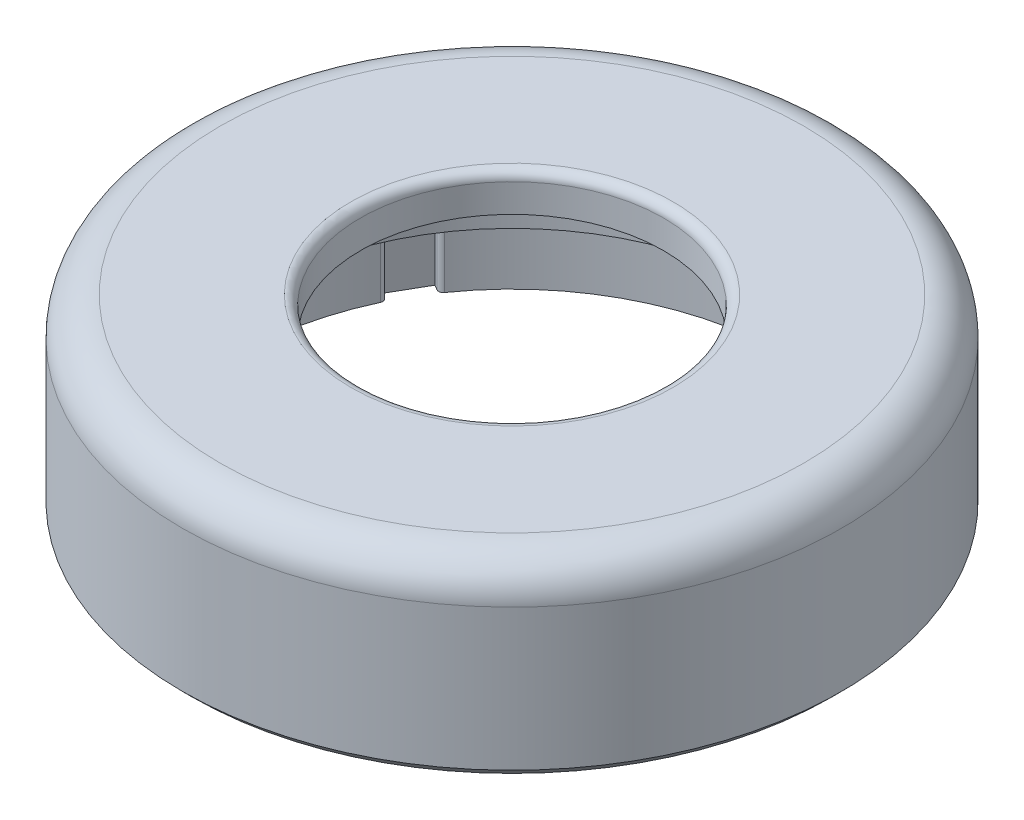
ISO-10303-21;
HEADER;
FILE_DESCRIPTION(('STEP AP214'),'2;1');
FILE_NAME('part.step','',(''),(''),'','','');
FILE_SCHEMA(('AUTOMOTIVE_DESIGN { 1 0 10303 214 1 1 1 1 }'));
ENDSEC;
DATA;
#1=APPLICATION_CONTEXT('core data for automotive mechanical design processes');
#2=APPLICATION_PROTOCOL_DEFINITION('international standard','automotive_design',2000,#1);
#3=PRODUCT_CONTEXT('',#1,'mechanical');
#4=PRODUCT('Part','Part','',(#3));
#5=PRODUCT_RELATED_PRODUCT_CATEGORY('part','',(#4));
#6=PRODUCT_DEFINITION_FORMATION('','',#4);
#7=PRODUCT_DEFINITION_CONTEXT('part definition',#1,'design');
#8=PRODUCT_DEFINITION('design','',#6,#7);
#9=PRODUCT_DEFINITION_SHAPE('','',#8);
#10=(LENGTH_UNIT() NAMED_UNIT(*) SI_UNIT(.MILLI.,.METRE.));
#11=(NAMED_UNIT(*) PLANE_ANGLE_UNIT() SI_UNIT($,.RADIAN.));
#12=(NAMED_UNIT(*) SI_UNIT($,.STERADIAN.) SOLID_ANGLE_UNIT());
#13=UNCERTAINTY_MEASURE_WITH_UNIT(LENGTH_MEASURE(1.E-05),#10,'distance_accuracy_value','');
#14=(GEOMETRIC_REPRESENTATION_CONTEXT(3) GLOBAL_UNCERTAINTY_ASSIGNED_CONTEXT((#13)) GLOBAL_UNIT_ASSIGNED_CONTEXT((#10,
#11,#12)) REPRESENTATION_CONTEXT('',''));
#15=CARTESIAN_POINT('',(0.,0.,0.));
#16=DIRECTION('',(0.,0.,1.));
#17=DIRECTION('',(1.,0.,0.));
#18=AXIS2_PLACEMENT_3D('',#15,#16,#17);
#19=CARTESIAN_POINT('',(0.,16.,0.));
#20=DIRECTION('',(0.,-1.,0.));
#21=DIRECTION('',(0.,0.,-1.));
#22=AXIS2_PLACEMENT_3D('',#19,#20,#21);
#23=PLANE('',#22);
#24=CARTESIAN_POINT('',(0.,16.,0.));
#25=DIRECTION('',(0.,-1.,0.));
#26=DIRECTION('',(0.,0.,-1.));
#27=AXIS2_PLACEMENT_3D('',#24,#25,#26);
#28=CIRCLE('',#27,16.1);
#29=CARTESIAN_POINT('',(0.,16.,-16.1));
#30=VERTEX_POINT('',#29);
#31=EDGE_CURVE('E408',#30,#30,#28,.F.);
#32=ORIENTED_EDGE('',*,*,#31,.T.);
#33=EDGE_LOOP('',(#32));
#34=FACE_BOUND('',#33,.T.);
#35=CARTESIAN_POINT('',(0.,16.,0.));
#36=DIRECTION('',(0.,-1.,0.));
#37=DIRECTION('',(0.,0.,-1.));
#38=AXIS2_PLACEMENT_3D('',#35,#36,#37);
#39=CIRCLE('',#38,17.85);
#40=CARTESIAN_POINT('',(0.,16.,-17.85));
#41=VERTEX_POINT('',#40);
#42=EDGE_CURVE('E100',#41,#41,#39,.F.);
#43=ORIENTED_EDGE('',*,*,#42,.F.);
#44=EDGE_LOOP('',(#43));
#45=FACE_BOUND('',#44,.T.);
#46=ADVANCED_FACE('F92',(#34,#45),#23,.T.);
#47=CARTESIAN_POINT('',(0.,20.,0.));
#48=DIRECTION('',(0.,-1.,0.));
#49=DIRECTION('',(0.,0.,-1.));
#50=AXIS2_PLACEMENT_3D('',#47,#48,#49);
#51=CYLINDRICAL_SURFACE('',#50,16.1);
#52=CARTESIAN_POINT('',(0.,19.,0.));
#53=DIRECTION('',(0.,1.,0.));
#54=DIRECTION('',(0.,0.,1.));
#55=AXIS2_PLACEMENT_3D('',#52,#53,#54);
#56=CIRCLE('',#55,16.1);
#57=CARTESIAN_POINT('',(0.,19.,16.1));
#58=VERTEX_POINT('',#57);
#59=EDGE_CURVE('E308',#58,#58,#56,.T.);
#60=ORIENTED_EDGE('',*,*,#59,.T.);
#61=EDGE_LOOP('',(#60));
#62=FACE_BOUND('',#61,.T.);
#63=ORIENTED_EDGE('',*,*,#31,.F.);
#64=EDGE_LOOP('',(#63));
#65=FACE_BOUND('',#64,.T.);
#66=ADVANCED_FACE('F373',(#62,#65),#51,.F.);
#67=CARTESIAN_POINT('',(0.,0.,0.));
#68=DIRECTION('',(0.,1.,0.));
#69=DIRECTION('',(0.,0.,1.));
#70=AXIS2_PLACEMENT_3D('',#67,#68,#69);
#71=PLANE('',#70);
#72=CARTESIAN_POINT('',(0.,0.,0.));
#73=DIRECTION('',(0.,1.,0.));
#74=DIRECTION('',(0.,0.,1.));
#75=AXIS2_PLACEMENT_3D('',#72,#73,#74);
#76=CIRCLE('',#75,34.);
#77=CARTESIAN_POINT('',(0.,0.,34.));
#78=VERTEX_POINT('',#77);
#79=EDGE_CURVE('E317',#78,#78,#76,.F.);
#80=ORIENTED_EDGE('',*,*,#79,.T.);
#81=EDGE_LOOP('',(#80));
#82=FACE_BOUND('',#81,.T.);
#83=CARTESIAN_POINT('',(0.,0.,0.));
#84=DIRECTION('',(0.,1.,0.));
#85=DIRECTION('',(0.,0.,1.));
#86=AXIS2_PLACEMENT_3D('',#83,#84,#85);
#87=CIRCLE('',#86,29.);
#88=CARTESIAN_POINT('',(-26.2699440314653,0.,-12.2837307274166));
#89=VERTEX_POINT('',#88);
#90=CARTESIAN_POINT('',(-2.49694915254237,0.,28.8923042509527));
#91=VERTEX_POINT('',#90);
#92=EDGE_CURVE('E302',#89,#91,#87,.T.);
#93=ORIENTED_EDGE('',*,*,#92,.T.);
#94=CARTESIAN_POINT('',(-2.54,0.,29.3904474276932));
#95=DIRECTION('',(0.,1.,0.));
#96=DIRECTION('',(0.,0.,1.));
#97=AXIS2_PLACEMENT_3D('',#94,#95,#96);
#98=CIRCLE('',#97,0.5);
#99=CARTESIAN_POINT('',(-2.04,0.,29.3904474276932));
#100=VERTEX_POINT('',#99);
#101=EDGE_CURVE('E336',#91,#100,#98,.F.);
#102=ORIENTED_EDGE('',*,*,#101,.T.);
#103=DIRECTION('',(0.,0.,1.));
#104=VECTOR('',#103,1.);
#105=CARTESIAN_POINT('',(-2.04000000000001,0.,0.));
#106=LINE('',#105,#104);
#107=CARTESIAN_POINT('',(-2.04,0.,30.));
#108=VERTEX_POINT('',#107);
#109=EDGE_CURVE('E263',#100,#108,#106,.T.);
#110=ORIENTED_EDGE('',*,*,#109,.T.);
#111=DIRECTION('',(1.,0.,0.));
#112=VECTOR('',#111,1.);
#113=CARTESIAN_POINT('',(0.,0.,30.));
#114=LINE('',#113,#112);
#115=CARTESIAN_POINT('',(2.04,0.,30.));
#116=VERTEX_POINT('',#115);
#117=EDGE_CURVE('E237',#108,#116,#114,.T.);
#118=ORIENTED_EDGE('',*,*,#117,.T.);
#119=DIRECTION('',(0.,0.,1.));
#120=VECTOR('',#119,1.);
#121=CARTESIAN_POINT('',(2.03999999999999,0.,0.));
#122=LINE('',#121,#120);
#123=CARTESIAN_POINT('',(2.04,0.,29.3904474276932));
#124=VERTEX_POINT('',#123);
#125=EDGE_CURVE('E267',#124,#116,#122,.T.);
#126=ORIENTED_EDGE('',*,*,#125,.F.);
#127=CARTESIAN_POINT('',(2.54,0.,29.3904474276932));
#128=DIRECTION('',(0.,1.,0.));
#129=DIRECTION('',(0.,0.,1.));
#130=AXIS2_PLACEMENT_3D('',#127,#128,#129);
#131=CIRCLE('',#130,0.5);
#132=CARTESIAN_POINT('',(2.49694915254237,0.,28.8923042509527));
#133=VERTEX_POINT('',#132);
#134=EDGE_CURVE('E334',#124,#133,#131,.F.);
#135=ORIENTED_EDGE('',*,*,#134,.T.);
#136=CARTESIAN_POINT('',(26.2699440314653,0.,-12.2837307274166));
#137=VERTEX_POINT('',#136);
#138=EDGE_CURVE('E298',#133,#137,#87,.T.);
#139=ORIENTED_EDGE('',*,*,#138,.T.);
#140=CARTESIAN_POINT('',(26.7228741009733,0.,-12.4955191882342));
#141=DIRECTION('',(0.,1.,0.));
#142=DIRECTION('',(0.,0.,1.));
#143=AXIS2_PLACEMENT_3D('',#140,#141,#142);
#144=CIRCLE('',#143,0.5);
#145=CARTESIAN_POINT('',(26.4728741009733,0.,-12.9285318901264));
#146=VERTEX_POINT('',#145);
#147=EDGE_CURVE('E332',#137,#146,#144,.F.);
#148=ORIENTED_EDGE('',*,*,#147,.T.);
#149=DIRECTION('',(0.866025403784438,0.,-0.5));
#150=VECTOR('',#149,1.);
#151=CARTESIAN_POINT('',(1.01999999999999,0.,1.76669182372024));
#152=LINE('',#151,#150);
#153=CARTESIAN_POINT('',(27.0007621135332,0.,-13.2333081762798));
#154=VERTEX_POINT('',#153);
#155=EDGE_CURVE('E269',#146,#154,#152,.T.);
#156=ORIENTED_EDGE('',*,*,#155,.T.);
#157=DIRECTION('',(-0.5,0.,-0.866025403784438));
#158=VECTOR('',#157,1.);
#159=CARTESIAN_POINT('',(25.9807621135332,0.,-15.));
#160=LINE('',#159,#158);
#161=CARTESIAN_POINT('',(24.9607621135332,0.,-16.7666918237203));
#162=VERTEX_POINT('',#161);
#163=EDGE_CURVE('E271',#154,#162,#160,.T.);
#164=ORIENTED_EDGE('',*,*,#163,.T.);
#165=DIRECTION('',(0.866025403784439,0.,-0.5));
#166=VECTOR('',#165,1.);
#167=CARTESIAN_POINT('',(-1.02000000000001,0.,-1.76669182372027));
#168=LINE('',#167,#166);
#169=CARTESIAN_POINT('',(24.4328741009733,0.,-16.4619155375669));
#170=VERTEX_POINT('',#169);
#171=EDGE_CURVE('E274',#170,#162,#168,.T.);
#172=ORIENTED_EDGE('',*,*,#171,.F.);
#173=CARTESIAN_POINT('',(24.1828741009733,0.,-16.8949282394591));
#174=DIRECTION('',(0.,1.,0.));
#175=DIRECTION('',(0.,0.,1.));
#176=AXIS2_PLACEMENT_3D('',#173,#174,#175);
#177=CIRCLE('',#176,0.5);
#178=CARTESIAN_POINT('',(23.7729948789229,0.,-16.6085735235361));
#179=VERTEX_POINT('',#178);
#180=EDGE_CURVE('E330',#170,#179,#177,.F.);
#181=ORIENTED_EDGE('',*,*,#180,.T.);
#182=CARTESIAN_POINT('',(-23.772994878923,0.,-16.6085735235361));
#183=VERTEX_POINT('',#182);
#184=EDGE_CURVE('E301',#179,#183,#87,.T.);
#185=ORIENTED_EDGE('',*,*,#184,.T.);
#186=CARTESIAN_POINT('',(-24.1828741009734,0.,-16.8949282394591));
#187=DIRECTION('',(0.,1.,0.));
#188=DIRECTION('',(0.,0.,1.));
#189=AXIS2_PLACEMENT_3D('',#186,#187,#188);
#190=CIRCLE('',#189,0.5);
#191=CARTESIAN_POINT('',(-24.4328741009734,0.,-16.4619155375669));
#192=VERTEX_POINT('',#191);
#193=EDGE_CURVE('E326',#183,#192,#190,.F.);
#194=ORIENTED_EDGE('',*,*,#193,.T.);
#195=DIRECTION('',(-0.866025403784439,0.,-0.5));
#196=VECTOR('',#195,1.);
#197=CARTESIAN_POINT('',(1.02,0.,-1.76669182372026));
#198=LINE('',#197,#196);
#199=CARTESIAN_POINT('',(-24.9607621135332,0.,-16.7666918237203));
#200=VERTEX_POINT('',#199);
#201=EDGE_CURVE('E276',#192,#200,#198,.T.);
#202=ORIENTED_EDGE('',*,*,#201,.T.);
#203=DIRECTION('',(-0.5,0.,0.866025403784439));
#204=VECTOR('',#203,1.);
#205=CARTESIAN_POINT('',(-25.9807621135332,0.,-15.));
#206=LINE('',#205,#204);
#207=CARTESIAN_POINT('',(-27.0007621135332,0.,-13.2333081762797));
#208=VERTEX_POINT('',#207);
#209=EDGE_CURVE('E278',#200,#208,#206,.T.);
#210=ORIENTED_EDGE('',*,*,#209,.T.);
#211=DIRECTION('',(-0.866025403784439,0.,-0.499999999999999));
#212=VECTOR('',#211,1.);
#213=CARTESIAN_POINT('',(-1.01999999999999,0.,1.76669182372024));
#214=LINE('',#213,#212);
#215=CARTESIAN_POINT('',(-26.4728741009733,0.,-12.9285318901264));
#216=VERTEX_POINT('',#215);
#217=EDGE_CURVE('E229',#216,#208,#214,.T.);
#218=ORIENTED_EDGE('',*,*,#217,.F.);
#219=CARTESIAN_POINT('',(-26.7228741009734,0.,-12.4955191882341));
#220=DIRECTION('',(0.,1.,0.));
#221=DIRECTION('',(0.,0.,1.));
#222=AXIS2_PLACEMENT_3D('',#219,#220,#221);
#223=CIRCLE('',#222,0.5);
#224=EDGE_CURVE('E328',#216,#89,#223,.F.);
#225=ORIENTED_EDGE('',*,*,#224,.T.);
#226=EDGE_LOOP('',(#93,#102,#110,#118,#126,#135,#139,#148,#156,#164,#172,#181,#185,#194,#202,
#210,#218,#225));
#227=FACE_BOUND('',#226,.T.);
#228=ADVANCED_FACE('F382',(#82,#227),#71,.F.);
#229=CARTESIAN_POINT('',(0.,20.,0.));
#230=DIRECTION('',(0.,-1.,0.));
#231=DIRECTION('',(0.,0.,-1.));
#232=AXIS2_PLACEMENT_3D('',#229,#230,#231);
#233=CYLINDRICAL_SURFACE('',#232,35.);
#234=CARTESIAN_POINT('',(0.,1.00000000000001,0.));
#235=DIRECTION('',(0.,1.,0.));
#236=DIRECTION('',(0.,0.,1.));
#237=AXIS2_PLACEMENT_3D('',#234,#235,#236);
#238=CIRCLE('',#237,35.);
#239=CARTESIAN_POINT('',(0.,1.00000000000001,35.));
#240=VERTEX_POINT('',#239);
#241=EDGE_CURVE('E314',#240,#240,#238,.T.);
#242=ORIENTED_EDGE('',*,*,#241,.T.);
#243=EDGE_LOOP('',(#242));
#244=FACE_BOUND('',#243,.T.);
#245=CARTESIAN_POINT('',(0.,16.,0.));
#246=DIRECTION('',(0.,1.,0.));
#247=DIRECTION('',(0.,0.,1.));
#248=AXIS2_PLACEMENT_3D('',#245,#246,#247);
#249=CIRCLE('',#248,35.);
#250=CARTESIAN_POINT('',(0.,16.,35.));
#251=VERTEX_POINT('',#250);
#252=EDGE_CURVE('E305',#251,#251,#249,.F.);
#253=ORIENTED_EDGE('',*,*,#252,.T.);
#254=EDGE_LOOP('',(#253));
#255=FACE_BOUND('',#254,.T.);
#256=ADVANCED_FACE('F468',(#244,#255),#233,.T.);
#257=CARTESIAN_POINT('',(0.,20.,0.));
#258=DIRECTION('',(0.,1.,0.));
#259=DIRECTION('',(0.,0.,1.));
#260=AXIS2_PLACEMENT_3D('',#257,#258,#259);
#261=PLANE('',#260);
#262=CARTESIAN_POINT('',(0.,20.,0.));
#263=DIRECTION('',(0.,1.,0.));
#264=DIRECTION('',(0.,0.,1.));
#265=AXIS2_PLACEMENT_3D('',#262,#263,#264);
#266=CIRCLE('',#265,17.1);
#267=CARTESIAN_POINT('',(0.,20.,17.1));
#268=VERTEX_POINT('',#267);
#269=EDGE_CURVE('E311',#268,#268,#266,.F.);
#270=ORIENTED_EDGE('',*,*,#269,.T.);
#271=EDGE_LOOP('',(#270));
#272=FACE_BOUND('',#271,.T.);
#273=CARTESIAN_POINT('',(0.,20.,0.));
#274=DIRECTION('',(0.,1.,0.));
#275=DIRECTION('',(0.,0.,1.));
#276=AXIS2_PLACEMENT_3D('',#273,#274,#275);
#277=CIRCLE('',#276,31.);
#278=CARTESIAN_POINT('',(0.,20.,31.));
#279=VERTEX_POINT('',#278);
#280=EDGE_CURVE('E238',#279,#279,#277,.T.);
#281=ORIENTED_EDGE('',*,*,#280,.T.);
#282=EDGE_LOOP('',(#281));
#283=FACE_BOUND('',#282,.T.);
#284=ADVANCED_FACE('F471',(#272,#283),#261,.T.);
#285=CARTESIAN_POINT('',(-2.04000000000001,7.,0.));
#286=DIRECTION('',(1.,0.,0.));
#287=DIRECTION('',(0.,0.,-1.));
#288=AXIS2_PLACEMENT_3D('',#285,#286,#287);
#289=PLANE('',#288);
#290=ORIENTED_EDGE('',*,*,#109,.F.);
#291=DIRECTION('',(0.,-1.,0.));
#292=VECTOR('',#291,1.);
#293=CARTESIAN_POINT('',(-2.04,7.,29.3904474276932));
#294=LINE('',#293,#292);
#295=CARTESIAN_POINT('',(-2.04,7.,29.3904474276932));
#296=VERTEX_POINT('',#295);
#297=EDGE_CURVE('E226',#100,#296,#294,.F.);
#298=ORIENTED_EDGE('',*,*,#297,.T.);
#299=DIRECTION('',(0.,0.,1.));
#300=VECTOR('',#299,1.);
#301=CARTESIAN_POINT('',(-2.04000000000001,7.,0.));
#302=LINE('',#301,#300);
#303=CARTESIAN_POINT('',(-2.04,7.,30.));
#304=VERTEX_POINT('',#303);
#305=EDGE_CURVE('E219',#296,#304,#302,.T.);
#306=ORIENTED_EDGE('',*,*,#305,.T.);
#307=DIRECTION('',(0.,-1.,0.));
#308=VECTOR('',#307,1.);
#309=CARTESIAN_POINT('',(-2.04,7.,30.));
#310=LINE('',#309,#308);
#311=EDGE_CURVE('E223',#304,#108,#310,.T.);
#312=ORIENTED_EDGE('',*,*,#311,.T.);
#313=EDGE_LOOP('',(#290,#298,#306,#312));
#314=FACE_BOUND('',#313,.T.);
#315=ADVANCED_FACE('F222',(#314),#289,.T.);
#316=CARTESIAN_POINT('',(0.,7.,30.));
#317=DIRECTION('',(0.,0.,-1.));
#318=DIRECTION('',(-1.,0.,0.));
#319=AXIS2_PLACEMENT_3D('',#316,#317,#318);
#320=PLANE('',#319);
#321=ORIENTED_EDGE('',*,*,#117,.F.);
#322=ORIENTED_EDGE('',*,*,#311,.F.);
#323=DIRECTION('',(1.,0.,0.));
#324=VECTOR('',#323,1.);
#325=CARTESIAN_POINT('',(0.,7.,30.));
#326=LINE('',#325,#324);
#327=CARTESIAN_POINT('',(2.04,7.,30.));
#328=VERTEX_POINT('',#327);
#329=EDGE_CURVE('E228',#304,#328,#326,.T.);
#330=ORIENTED_EDGE('',*,*,#329,.T.);
#331=DIRECTION('',(0.,-1.,0.));
#332=VECTOR('',#331,1.);
#333=CARTESIAN_POINT('',(2.04,7.,30.));
#334=LINE('',#333,#332);
#335=EDGE_CURVE('E239',#328,#116,#334,.T.);
#336=ORIENTED_EDGE('',*,*,#335,.T.);
#337=EDGE_LOOP('',(#321,#322,#330,#336));
#338=FACE_BOUND('',#337,.T.);
#339=ADVANCED_FACE('F233',(#338),#320,.T.);
#340=CARTESIAN_POINT('',(2.03999999999999,7.,0.));
#341=DIRECTION('',(1.,0.,0.));
#342=DIRECTION('',(0.,0.,-1.));
#343=AXIS2_PLACEMENT_3D('',#340,#341,#342);
#344=PLANE('',#343);
#345=DIRECTION('',(0.,0.,1.));
#346=VECTOR('',#345,1.);
#347=CARTESIAN_POINT('',(2.03999999999999,7.,0.));
#348=LINE('',#347,#346);
#349=CARTESIAN_POINT('',(2.04,7.,29.3904474276932));
#350=VERTEX_POINT('',#349);
#351=EDGE_CURVE('E243',#350,#328,#348,.T.);
#352=ORIENTED_EDGE('',*,*,#351,.F.);
#353=DIRECTION('',(0.,1.,0.));
#354=VECTOR('',#353,1.);
#355=CARTESIAN_POINT('',(2.04,0.,29.3904474276932));
#356=LINE('',#355,#354);
#357=EDGE_CURVE('E343',#350,#124,#356,.F.);
#358=ORIENTED_EDGE('',*,*,#357,.T.);
#359=ORIENTED_EDGE('',*,*,#125,.T.);
#360=ORIENTED_EDGE('',*,*,#335,.F.);
#361=EDGE_LOOP('',(#352,#358,#359,#360));
#362=FACE_BOUND('',#361,.T.);
#363=ADVANCED_FACE('F489',(#362),#344,.F.);
#364=CARTESIAN_POINT('',(0.,7.,0.));
#365=DIRECTION('',(0.,1.,0.));
#366=DIRECTION('',(0.,0.,1.));
#367=AXIS2_PLACEMENT_3D('',#364,#365,#366);
#368=PLANE('',#367);
#369=CARTESIAN_POINT('',(0.,7.,0.));
#370=DIRECTION('',(0.,-1.,0.));
#371=DIRECTION('',(0.,0.,-1.));
#372=AXIS2_PLACEMENT_3D('',#369,#370,#371);
#373=CIRCLE('',#372,27.);
#374=CARTESIAN_POINT('',(0.,7.,-27.));
#375=VERTEX_POINT('',#374);
#376=EDGE_CURVE('E409',#375,#375,#373,.T.);
#377=ORIENTED_EDGE('',*,*,#376,.F.);
#378=EDGE_LOOP('',(#377));
#379=FACE_BOUND('',#378,.T.);
#380=CARTESIAN_POINT('',(0.,7.,0.));
#381=DIRECTION('',(0.,1.,0.));
#382=DIRECTION('',(0.,0.,1.));
#383=AXIS2_PLACEMENT_3D('',#380,#381,#382);
#384=CIRCLE('',#383,29.);
#385=CARTESIAN_POINT('',(-26.2699440314653,7.,-12.2837307274166));
#386=VERTEX_POINT('',#385);
#387=CARTESIAN_POINT('',(-2.49694915254237,7.,28.8923042509527));
#388=VERTEX_POINT('',#387);
#389=EDGE_CURVE('E297',#386,#388,#384,.T.);
#390=ORIENTED_EDGE('',*,*,#389,.F.);
#391=CARTESIAN_POINT('',(-26.7228741009734,7.,-12.4955191882341));
#392=DIRECTION('',(0.,1.,0.));
#393=DIRECTION('',(0.,0.,1.));
#394=AXIS2_PLACEMENT_3D('',#391,#392,#393);
#395=CIRCLE('',#394,0.5);
#396=CARTESIAN_POINT('',(-26.4728741009733,7.,-12.9285318901264));
#397=VERTEX_POINT('',#396);
#398=EDGE_CURVE('E115',#386,#397,#395,.T.);
#399=ORIENTED_EDGE('',*,*,#398,.T.);
#400=DIRECTION('',(-0.866025403784439,0.,-0.499999999999999));
#401=VECTOR('',#400,1.);
#402=CARTESIAN_POINT('',(-1.01999999999999,7.,1.76669182372024));
#403=LINE('',#402,#401);
#404=CARTESIAN_POINT('',(-27.0007621135332,7.,-13.2333081762797));
#405=VERTEX_POINT('',#404);
#406=EDGE_CURVE('E260',#397,#405,#403,.T.);
#407=ORIENTED_EDGE('',*,*,#406,.T.);
#408=DIRECTION('',(-0.5,0.,0.866025403784439));
#409=VECTOR('',#408,1.);
#410=CARTESIAN_POINT('',(-25.9807621135332,7.,-15.));
#411=LINE('',#410,#409);
#412=CARTESIAN_POINT('',(-24.9607621135332,7.,-16.7666918237203));
#413=VERTEX_POINT('',#412);
#414=EDGE_CURVE('E257',#413,#405,#411,.T.);
#415=ORIENTED_EDGE('',*,*,#414,.F.);
#416=DIRECTION('',(-0.866025403784439,0.,-0.5));
#417=VECTOR('',#416,1.);
#418=CARTESIAN_POINT('',(1.02,7.,-1.76669182372026));
#419=LINE('',#418,#417);
#420=CARTESIAN_POINT('',(-24.4328741009734,7.,-16.4619155375669));
#421=VERTEX_POINT('',#420);
#422=EDGE_CURVE('E255',#421,#413,#419,.T.);
#423=ORIENTED_EDGE('',*,*,#422,.F.);
#424=CARTESIAN_POINT('',(-24.1828741009734,7.,-16.8949282394591));
#425=DIRECTION('',(0.,1.,0.));
#426=DIRECTION('',(0.,0.,1.));
#427=AXIS2_PLACEMENT_3D('',#424,#425,#426);
#428=CIRCLE('',#427,0.5);
#429=CARTESIAN_POINT('',(-23.772994878923,7.,-16.6085735235361));
#430=VERTEX_POINT('',#429);
#431=EDGE_CURVE('E107',#421,#430,#428,.T.);
#432=ORIENTED_EDGE('',*,*,#431,.T.);
#433=CARTESIAN_POINT('',(23.7729948789229,7.,-16.6085735235361));
#434=VERTEX_POINT('',#433);
#435=EDGE_CURVE('E294',#434,#430,#384,.T.);
#436=ORIENTED_EDGE('',*,*,#435,.F.);
#437=CARTESIAN_POINT('',(24.1828741009733,7.,-16.8949282394591));
#438=DIRECTION('',(0.,1.,0.));
#439=DIRECTION('',(0.,0.,1.));
#440=AXIS2_PLACEMENT_3D('',#437,#438,#439);
#441=CIRCLE('',#440,0.5);
#442=CARTESIAN_POINT('',(24.4328741009733,7.,-16.4619155375669));
#443=VERTEX_POINT('',#442);
#444=EDGE_CURVE('E365',#434,#443,#441,.T.);
#445=ORIENTED_EDGE('',*,*,#444,.T.);
#446=DIRECTION('',(0.866025403784439,0.,-0.5));
#447=VECTOR('',#446,1.);
#448=CARTESIAN_POINT('',(-1.02000000000001,7.,-1.76669182372027));
#449=LINE('',#448,#447);
#450=CARTESIAN_POINT('',(24.9607621135332,7.,-16.7666918237203));
#451=VERTEX_POINT('',#450);
#452=EDGE_CURVE('E253',#443,#451,#449,.T.);
#453=ORIENTED_EDGE('',*,*,#452,.T.);
#454=DIRECTION('',(-0.5,0.,-0.866025403784438));
#455=VECTOR('',#454,1.);
#456=CARTESIAN_POINT('',(25.9807621135332,7.,-15.));
#457=LINE('',#456,#455);
#458=CARTESIAN_POINT('',(27.0007621135332,7.,-13.2333081762798));
#459=VERTEX_POINT('',#458);
#460=EDGE_CURVE('E250',#459,#451,#457,.T.);
#461=ORIENTED_EDGE('',*,*,#460,.F.);
#462=DIRECTION('',(0.866025403784438,0.,-0.5));
#463=VECTOR('',#462,1.);
#464=CARTESIAN_POINT('',(1.01999999999999,7.,1.76669182372024));
#465=LINE('',#464,#463);
#466=CARTESIAN_POINT('',(26.4728741009733,7.,-12.9285318901264));
#467=VERTEX_POINT('',#466);
#468=EDGE_CURVE('E245',#467,#459,#465,.T.);
#469=ORIENTED_EDGE('',*,*,#468,.F.);
#470=CARTESIAN_POINT('',(26.7228741009733,7.,-12.4955191882342));
#471=DIRECTION('',(0.,1.,0.));
#472=DIRECTION('',(0.,0.,1.));
#473=AXIS2_PLACEMENT_3D('',#470,#471,#472);
#474=CIRCLE('',#473,0.5);
#475=CARTESIAN_POINT('',(26.2699440314653,7.,-12.2837307274166));
#476=VERTEX_POINT('',#475);
#477=EDGE_CURVE('E363',#467,#476,#474,.T.);
#478=ORIENTED_EDGE('',*,*,#477,.T.);
#479=CARTESIAN_POINT('',(2.49694915254237,7.,28.8923042509527));
#480=VERTEX_POINT('',#479);
#481=EDGE_CURVE('E265',#480,#476,#384,.T.);
#482=ORIENTED_EDGE('',*,*,#481,.F.);
#483=CARTESIAN_POINT('',(2.54,7.,29.3904474276932));
#484=DIRECTION('',(0.,1.,0.));
#485=DIRECTION('',(0.,0.,1.));
#486=AXIS2_PLACEMENT_3D('',#483,#484,#485);
#487=CIRCLE('',#486,0.5);
#488=EDGE_CURVE('E361',#480,#350,#487,.T.);
#489=ORIENTED_EDGE('',*,*,#488,.T.);
#490=ORIENTED_EDGE('',*,*,#351,.T.);
#491=ORIENTED_EDGE('',*,*,#329,.F.);
#492=ORIENTED_EDGE('',*,*,#305,.F.);
#493=CARTESIAN_POINT('',(-2.54,7.,29.3904474276932));
#494=DIRECTION('',(0.,1.,0.));
#495=DIRECTION('',(0.,0.,1.));
#496=AXIS2_PLACEMENT_3D('',#493,#494,#495);
#497=CIRCLE('',#496,0.5);
#498=EDGE_CURVE('E359',#296,#388,#497,.T.);
#499=ORIENTED_EDGE('',*,*,#498,.T.);
#500=EDGE_LOOP('',(#390,#399,#407,#415,#423,#432,#436,#445,#453,#461,#469,#478,#482,#489,#490,
#491,#492,#499));
#501=FACE_BOUND('',#500,.T.);
#502=ADVANCED_FACE('F241',(#379,#501),#368,.F.);
#503=CARTESIAN_POINT('',(1.01999999999999,7.,1.76669182372024));
#504=DIRECTION('',(-0.5,0.,-0.866025403784438));
#505=DIRECTION('',(-0.866025403784438,0.,0.5));
#506=AXIS2_PLACEMENT_3D('',#503,#504,#505);
#507=PLANE('',#506);
#508=ORIENTED_EDGE('',*,*,#155,.F.);
#509=DIRECTION('',(0.,-1.,0.));
#510=VECTOR('',#509,1.);
#511=CARTESIAN_POINT('',(26.4728741009733,7.,-12.9285318901264));
#512=LINE('',#511,#510);
#513=EDGE_CURVE('E345',#146,#467,#512,.F.);
#514=ORIENTED_EDGE('',*,*,#513,.T.);
#515=ORIENTED_EDGE('',*,*,#468,.T.);
#516=DIRECTION('',(0.,-1.,0.));
#517=VECTOR('',#516,1.);
#518=CARTESIAN_POINT('',(27.0007621135332,7.,-13.2333081762798));
#519=LINE('',#518,#517);
#520=EDGE_CURVE('E290',#459,#154,#519,.T.);
#521=ORIENTED_EDGE('',*,*,#520,.T.);
#522=EDGE_LOOP('',(#508,#514,#515,#521));
#523=FACE_BOUND('',#522,.T.);
#524=ADVANCED_FACE('F493',(#523),#507,.T.);
#525=CARTESIAN_POINT('',(25.9807621135332,7.,-15.));
#526=DIRECTION('',(-0.866025403784438,0.,0.5));
#527=DIRECTION('',(0.5,0.,0.866025403784438));
#528=AXIS2_PLACEMENT_3D('',#525,#526,#527);
#529=PLANE('',#528);
#530=ORIENTED_EDGE('',*,*,#163,.F.);
#531=ORIENTED_EDGE('',*,*,#520,.F.);
#532=ORIENTED_EDGE('',*,*,#460,.T.);
#533=DIRECTION('',(0.,-1.,0.));
#534=VECTOR('',#533,1.);
#535=CARTESIAN_POINT('',(24.9607621135332,7.,-16.7666918237203));
#536=LINE('',#535,#534);
#537=EDGE_CURVE('E287',#451,#162,#536,.T.);
#538=ORIENTED_EDGE('',*,*,#537,.T.);
#539=EDGE_LOOP('',(#530,#531,#532,#538));
#540=FACE_BOUND('',#539,.T.);
#541=ADVANCED_FACE('F496',(#540),#529,.T.);
#542=CARTESIAN_POINT('',(-1.02000000000001,7.,-1.76669182372027));
#543=DIRECTION('',(-0.5,0.,-0.866025403784439));
#544=DIRECTION('',(-0.866025403784439,0.,0.5));
#545=AXIS2_PLACEMENT_3D('',#542,#543,#544);
#546=PLANE('',#545);
#547=ORIENTED_EDGE('',*,*,#452,.F.);
#548=DIRECTION('',(0.,1.,0.));
#549=VECTOR('',#548,1.);
#550=CARTESIAN_POINT('',(24.4328741009733,0.,-16.4619155375669));
#551=LINE('',#550,#549);
#552=EDGE_CURVE('E353',#443,#170,#551,.F.);
#553=ORIENTED_EDGE('',*,*,#552,.T.);
#554=ORIENTED_EDGE('',*,*,#171,.T.);
#555=ORIENTED_EDGE('',*,*,#537,.F.);
#556=EDGE_LOOP('',(#547,#553,#554,#555));
#557=FACE_BOUND('',#556,.T.);
#558=ADVANCED_FACE('F500',(#557),#546,.F.);
#559=CARTESIAN_POINT('',(1.02,7.,-1.76669182372026));
#560=DIRECTION('',(-0.5,0.,0.866025403784439));
#561=DIRECTION('',(0.866025403784439,0.,0.5));
#562=AXIS2_PLACEMENT_3D('',#559,#560,#561);
#563=PLANE('',#562);
#564=ORIENTED_EDGE('',*,*,#201,.F.);
#565=DIRECTION('',(0.,-1.,0.));
#566=VECTOR('',#565,1.);
#567=CARTESIAN_POINT('',(-24.4328741009734,7.,-16.4619155375669));
#568=LINE('',#567,#566);
#569=EDGE_CURVE('E357',#192,#421,#568,.F.);
#570=ORIENTED_EDGE('',*,*,#569,.T.);
#571=ORIENTED_EDGE('',*,*,#422,.T.);
#572=DIRECTION('',(0.,-1.,0.));
#573=VECTOR('',#572,1.);
#574=CARTESIAN_POINT('',(-24.9607621135332,7.,-16.7666918237203));
#575=LINE('',#574,#573);
#576=EDGE_CURVE('E284',#413,#200,#575,.T.);
#577=ORIENTED_EDGE('',*,*,#576,.T.);
#578=EDGE_LOOP('',(#564,#570,#571,#577));
#579=FACE_BOUND('',#578,.T.);
#580=ADVANCED_FACE('F504',(#579),#563,.T.);
#581=CARTESIAN_POINT('',(-25.9807621135332,7.,-15.));
#582=DIRECTION('',(0.866025403784439,0.,0.5));
#583=DIRECTION('',(0.5,0.,-0.866025403784439));
#584=AXIS2_PLACEMENT_3D('',#581,#582,#583);
#585=PLANE('',#584);
#586=ORIENTED_EDGE('',*,*,#209,.F.);
#587=ORIENTED_EDGE('',*,*,#576,.F.);
#588=ORIENTED_EDGE('',*,*,#414,.T.);
#589=DIRECTION('',(0.,-1.,0.));
#590=VECTOR('',#589,1.);
#591=CARTESIAN_POINT('',(-27.0007621135332,7.,-13.2333081762797));
#592=LINE('',#591,#590);
#593=EDGE_CURVE('E262',#405,#208,#592,.T.);
#594=ORIENTED_EDGE('',*,*,#593,.T.);
#595=EDGE_LOOP('',(#586,#587,#588,#594));
#596=FACE_BOUND('',#595,.T.);
#597=ADVANCED_FACE('F508',(#596),#585,.T.);
#598=CARTESIAN_POINT('',(-1.01999999999999,7.,1.76669182372024));
#599=DIRECTION('',(-0.499999999999999,0.,0.866025403784439));
#600=DIRECTION('',(0.866025403784439,0.,0.499999999999999));
#601=AXIS2_PLACEMENT_3D('',#598,#599,#600);
#602=PLANE('',#601);
#603=ORIENTED_EDGE('',*,*,#406,.F.);
#604=DIRECTION('',(0.,1.,0.));
#605=VECTOR('',#604,1.);
#606=CARTESIAN_POINT('',(-26.4728741009734,0.,-12.9285318901264));
#607=LINE('',#606,#605);
#608=EDGE_CURVE('E355',#397,#216,#607,.F.);
#609=ORIENTED_EDGE('',*,*,#608,.T.);
#610=ORIENTED_EDGE('',*,*,#217,.T.);
#611=ORIENTED_EDGE('',*,*,#593,.F.);
#612=EDGE_LOOP('',(#603,#609,#610,#611));
#613=FACE_BOUND('',#612,.T.);
#614=ADVANCED_FACE('F483',(#613),#602,.F.);
#615=CARTESIAN_POINT('',(0.,7.,0.));
#616=DIRECTION('',(0.,-1.,0.));
#617=DIRECTION('',(0.,0.,-1.));
#618=AXIS2_PLACEMENT_3D('',#615,#616,#617);
#619=CYLINDRICAL_SURFACE('',#618,29.);
#620=ORIENTED_EDGE('',*,*,#389,.T.);
#621=DIRECTION('',(0.,-1.,0.));
#622=VECTOR('',#621,1.);
#623=CARTESIAN_POINT('',(-2.49694915254237,7.,28.8923042509527));
#624=LINE('',#623,#622);
#625=EDGE_CURVE('E324',#388,#91,#624,.T.);
#626=ORIENTED_EDGE('',*,*,#625,.T.);
#627=ORIENTED_EDGE('',*,*,#92,.F.);
#628=DIRECTION('',(0.,-1.,0.));
#629=VECTOR('',#628,1.);
#630=CARTESIAN_POINT('',(-26.2699440314653,7.,-12.2837307274166));
#631=LINE('',#630,#629);
#632=EDGE_CURVE('E321',#89,#386,#631,.F.);
#633=ORIENTED_EDGE('',*,*,#632,.T.);
#634=EDGE_LOOP('',(#620,#626,#627,#633));
#635=FACE_BOUND('',#634,.T.);
#636=ADVANCED_FACE('F479',(#635),#619,.F.);
#637=ORIENTED_EDGE('',*,*,#184,.F.);
#638=DIRECTION('',(0.,-1.,0.));
#639=VECTOR('',#638,1.);
#640=CARTESIAN_POINT('',(23.7729948789229,7.,-16.6085735235361));
#641=LINE('',#640,#639);
#642=EDGE_CURVE('E350',#179,#434,#641,.F.);
#643=ORIENTED_EDGE('',*,*,#642,.T.);
#644=ORIENTED_EDGE('',*,*,#435,.T.);
#645=DIRECTION('',(0.,-1.,0.));
#646=VECTOR('',#645,1.);
#647=CARTESIAN_POINT('',(-23.772994878923,7.,-16.6085735235361));
#648=LINE('',#647,#646);
#649=EDGE_CURVE('E348',#430,#183,#648,.T.);
#650=ORIENTED_EDGE('',*,*,#649,.T.);
#651=EDGE_LOOP('',(#637,#643,#644,#650));
#652=FACE_BOUND('',#651,.T.);
#653=ADVANCED_FACE('F482',(#652),#619,.F.);
#654=ORIENTED_EDGE('',*,*,#138,.F.);
#655=DIRECTION('',(0.,-1.,0.));
#656=VECTOR('',#655,1.);
#657=CARTESIAN_POINT('',(2.49694915254237,7.,28.8923042509527));
#658=LINE('',#657,#656);
#659=EDGE_CURVE('E340',#133,#480,#658,.F.);
#660=ORIENTED_EDGE('',*,*,#659,.T.);
#661=ORIENTED_EDGE('',*,*,#481,.T.);
#662=DIRECTION('',(0.,-1.,0.));
#663=VECTOR('',#662,1.);
#664=CARTESIAN_POINT('',(26.2699440314653,7.,-12.2837307274166));
#665=LINE('',#664,#663);
#666=EDGE_CURVE('E338',#476,#137,#665,.T.);
#667=ORIENTED_EDGE('',*,*,#666,.T.);
#668=EDGE_LOOP('',(#654,#660,#661,#667));
#669=FACE_BOUND('',#668,.T.);
#670=ADVANCED_FACE('F466',(#669),#619,.F.);
#671=CARTESIAN_POINT('',(0.,16.,0.));
#672=DIRECTION('',(0.,1.,0.));
#673=DIRECTION('',(0.,0.,1.));
#674=AXIS2_PLACEMENT_3D('',#671,#672,#673);
#675=TOROIDAL_SURFACE('',#674,31.,4.);
#676=ORIENTED_EDGE('',*,*,#252,.F.);
#677=EDGE_LOOP('',(#676));
#678=FACE_BOUND('',#677,.T.);
#679=ORIENTED_EDGE('',*,*,#280,.F.);
#680=EDGE_LOOP('',(#679));
#681=FACE_BOUND('',#680,.T.);
#682=ADVANCED_FACE('F462',(#678,#681),#675,.T.);
#683=CARTESIAN_POINT('',(0.,19.,0.));
#684=DIRECTION('',(0.,1.,0.));
#685=DIRECTION('',(0.,0.,1.));
#686=AXIS2_PLACEMENT_3D('',#683,#684,#685);
#687=TOROIDAL_SURFACE('',#686,17.1,1.);
#688=ORIENTED_EDGE('',*,*,#269,.F.);
#689=EDGE_LOOP('',(#688));
#690=FACE_BOUND('',#689,.T.);
#691=ORIENTED_EDGE('',*,*,#59,.F.);
#692=EDGE_LOOP('',(#691));
#693=FACE_BOUND('',#692,.T.);
#694=ADVANCED_FACE('F399',(#690,#693),#687,.T.);
#695=CARTESIAN_POINT('',(0.,16.,0.));
#696=DIRECTION('',(0.,-1.,0.));
#697=DIRECTION('',(0.,0.,-1.));
#698=AXIS2_PLACEMENT_3D('',#695,#696,#697);
#699=CYLINDRICAL_SURFACE('',#698,27.);
#700=CARTESIAN_POINT('',(0.,16.,0.));
#701=DIRECTION('',(0.,-1.,0.));
#702=DIRECTION('',(0.,0.,-1.));
#703=AXIS2_PLACEMENT_3D('',#700,#701,#702);
#704=CIRCLE('',#703,27.);
#705=CARTESIAN_POINT('',(0.,16.,-27.));
#706=VERTEX_POINT('',#705);
#707=EDGE_CURVE('E407',#706,#706,#704,.T.);
#708=ORIENTED_EDGE('',*,*,#707,.F.);
#709=EDGE_LOOP('',(#708));
#710=FACE_BOUND('',#709,.T.);
#711=ORIENTED_EDGE('',*,*,#376,.T.);
#712=EDGE_LOOP('',(#711));
#713=FACE_BOUND('',#712,.T.);
#714=ADVANCED_FACE('F389',(#710,#713),#699,.F.);
#715=CARTESIAN_POINT('',(0.,16.,0.));
#716=DIRECTION('',(0.,-1.,0.));
#717=DIRECTION('',(1.,0.,0.));
#718=AXIS2_PLACEMENT_3D('',#715,#716,#717);
#719=CIRCLE('',#718,19.85);
#720=CARTESIAN_POINT('',(19.85,16.,0.));
#721=VERTEX_POINT('',#720);
#722=EDGE_CURVE('E404',#721,#721,#719,.T.);
#723=ORIENTED_EDGE('',*,*,#722,.F.);
#724=EDGE_LOOP('',(#723));
#725=FACE_BOUND('',#724,.T.);
#726=ORIENTED_EDGE('',*,*,#707,.T.);
#727=EDGE_LOOP('',(#726));
#728=FACE_BOUND('',#727,.T.);
#729=ADVANCED_FACE('F376',(#725,#728),#23,.T.);
#730=CARTESIAN_POINT('',(0.,1.00000000000001,0.));
#731=DIRECTION('',(0.,1.,0.));
#732=DIRECTION('',(0.,0.,1.));
#733=AXIS2_PLACEMENT_3D('',#730,#731,#732);
#734=CONICAL_SURFACE('',#733,35.,0.785398163397448);
#735=ORIENTED_EDGE('',*,*,#79,.F.);
#736=EDGE_LOOP('',(#735));
#737=FACE_BOUND('',#736,.T.);
#738=ORIENTED_EDGE('',*,*,#241,.F.);
#739=EDGE_LOOP('',(#738));
#740=FACE_BOUND('',#739,.T.);
#741=ADVANCED_FACE('F388',(#737,#740),#734,.T.);
#742=CARTESIAN_POINT('',(-2.54,7.,29.3904474276932));
#743=DIRECTION('',(0.,-1.,0.));
#744=DIRECTION('',(0.,0.,-1.));
#745=AXIS2_PLACEMENT_3D('',#742,#743,#744);
#746=CYLINDRICAL_SURFACE('',#745,0.5);
#747=ORIENTED_EDGE('',*,*,#101,.F.);
#748=ORIENTED_EDGE('',*,*,#625,.F.);
#749=ORIENTED_EDGE('',*,*,#498,.F.);
#750=ORIENTED_EDGE('',*,*,#297,.F.);
#751=EDGE_LOOP('',(#747,#748,#749,#750));
#752=FACE_BOUND('',#751,.T.);
#753=ADVANCED_FACE('F395',(#752),#746,.T.);
#754=CARTESIAN_POINT('',(2.54,7.,29.3904474276932));
#755=DIRECTION('',(0.,-1.,0.));
#756=DIRECTION('',(0.,0.,-1.));
#757=AXIS2_PLACEMENT_3D('',#754,#755,#756);
#758=CYLINDRICAL_SURFACE('',#757,0.5);
#759=ORIENTED_EDGE('',*,*,#134,.F.);
#760=ORIENTED_EDGE('',*,*,#357,.F.);
#761=ORIENTED_EDGE('',*,*,#488,.F.);
#762=ORIENTED_EDGE('',*,*,#659,.F.);
#763=EDGE_LOOP('',(#759,#760,#761,#762));
#764=FACE_BOUND('',#763,.T.);
#765=ADVANCED_FACE('F449',(#764),#758,.T.);
#766=CARTESIAN_POINT('',(26.7228741009733,7.,-12.4955191882342));
#767=DIRECTION('',(0.,-1.,0.));
#768=DIRECTION('',(0.,0.,-1.));
#769=AXIS2_PLACEMENT_3D('',#766,#767,#768);
#770=CYLINDRICAL_SURFACE('',#769,0.5);
#771=ORIENTED_EDGE('',*,*,#147,.F.);
#772=ORIENTED_EDGE('',*,*,#666,.F.);
#773=ORIENTED_EDGE('',*,*,#477,.F.);
#774=ORIENTED_EDGE('',*,*,#513,.F.);
#775=EDGE_LOOP('',(#771,#772,#773,#774));
#776=FACE_BOUND('',#775,.T.);
#777=ADVANCED_FACE('F445',(#776),#770,.T.);
#778=CARTESIAN_POINT('',(24.1828741009733,7.,-16.8949282394591));
#779=DIRECTION('',(0.,-1.,0.));
#780=DIRECTION('',(0.,0.,-1.));
#781=AXIS2_PLACEMENT_3D('',#778,#779,#780);
#782=CYLINDRICAL_SURFACE('',#781,0.5);
#783=ORIENTED_EDGE('',*,*,#180,.F.);
#784=ORIENTED_EDGE('',*,*,#552,.F.);
#785=ORIENTED_EDGE('',*,*,#444,.F.);
#786=ORIENTED_EDGE('',*,*,#642,.F.);
#787=EDGE_LOOP('',(#783,#784,#785,#786));
#788=FACE_BOUND('',#787,.T.);
#789=ADVANCED_FACE('F438',(#788),#782,.T.);
#790=CARTESIAN_POINT('',(-26.7228741009734,7.,-12.4955191882341));
#791=DIRECTION('',(0.,-1.,0.));
#792=DIRECTION('',(0.,0.,-1.));
#793=AXIS2_PLACEMENT_3D('',#790,#791,#792);
#794=CYLINDRICAL_SURFACE('',#793,0.5);
#795=ORIENTED_EDGE('',*,*,#224,.F.);
#796=ORIENTED_EDGE('',*,*,#608,.F.);
#797=ORIENTED_EDGE('',*,*,#398,.F.);
#798=ORIENTED_EDGE('',*,*,#632,.F.);
#799=EDGE_LOOP('',(#795,#796,#797,#798));
#800=FACE_BOUND('',#799,.T.);
#801=ADVANCED_FACE('F433',(#800),#794,.T.);
#802=CARTESIAN_POINT('',(-24.1828741009734,7.,-16.8949282394591));
#803=DIRECTION('',(0.,-1.,0.));
#804=DIRECTION('',(0.,0.,-1.));
#805=AXIS2_PLACEMENT_3D('',#802,#803,#804);
#806=CYLINDRICAL_SURFACE('',#805,0.5);
#807=ORIENTED_EDGE('',*,*,#193,.F.);
#808=ORIENTED_EDGE('',*,*,#649,.F.);
#809=ORIENTED_EDGE('',*,*,#431,.F.);
#810=ORIENTED_EDGE('',*,*,#569,.F.);
#811=EDGE_LOOP('',(#807,#808,#809,#810));
#812=FACE_BOUND('',#811,.T.);
#813=ADVANCED_FACE('F428',(#812),#806,.T.);
#814=CARTESIAN_POINT('',(0.,15.,0.));
#815=DIRECTION('',(0.,-1.,0.));
#816=DIRECTION('',(0.,0.,-1.));
#817=AXIS2_PLACEMENT_3D('',#814,#815,#816);
#818=PLANE('',#817);
#819=CARTESIAN_POINT('',(0.,15.,0.));
#820=DIRECTION('',(0.,-1.,0.));
#821=DIRECTION('',(0.,0.,-1.));
#822=AXIS2_PLACEMENT_3D('',#819,#820,#821);
#823=CIRCLE('',#822,18.85);
#824=CARTESIAN_POINT('',(0.,15.,-18.85));
#825=VERTEX_POINT('',#824);
#826=EDGE_CURVE('E12',#825,#825,#823,.F.);
#827=ORIENTED_EDGE('',*,*,#826,.T.);
#828=EDGE_LOOP('',(#827));
#829=FACE_BOUND('',#828,.T.);
#830=CARTESIAN_POINT('',(0.,15.,0.));
#831=DIRECTION('',(0.,-1.,0.));
#832=DIRECTION('',(1.,0.,0.));
#833=AXIS2_PLACEMENT_3D('',#830,#831,#832);
#834=CIRCLE('',#833,19.85);
#835=CARTESIAN_POINT('',(19.85,15.,0.));
#836=VERTEX_POINT('',#835);
#837=EDGE_CURVE('E413',#836,#836,#834,.T.);
#838=ORIENTED_EDGE('',*,*,#837,.T.);
#839=EDGE_LOOP('',(#838));
#840=FACE_BOUND('',#839,.T.);
#841=ADVANCED_FACE('F419',(#829,#840),#818,.T.);
#842=CARTESIAN_POINT('',(0.,15.,0.));
#843=DIRECTION('',(0.,1.,0.));
#844=DIRECTION('',(0.,0.,1.));
#845=AXIS2_PLACEMENT_3D('',#842,#843,#844);
#846=CYLINDRICAL_SURFACE('',#845,19.85);
#847=ORIENTED_EDGE('',*,*,#837,.F.);
#848=EDGE_LOOP('',(#847));
#849=FACE_BOUND('',#848,.T.);
#850=ORIENTED_EDGE('',*,*,#722,.T.);
#851=EDGE_LOOP('',(#850));
#852=FACE_BOUND('',#851,.T.);
#853=ADVANCED_FACE('F421',(#849,#852),#846,.T.);
#854=CARTESIAN_POINT('',(0.,16.,0.));
#855=DIRECTION('',(0.,-1.,0.));
#856=DIRECTION('',(0.,0.,-1.));
#857=AXIS2_PLACEMENT_3D('',#854,#855,#856);
#858=TOROIDAL_SURFACE('',#857,18.85,1.);
#859=ORIENTED_EDGE('',*,*,#826,.F.);
#860=EDGE_LOOP('',(#859));
#861=FACE_BOUND('',#860,.T.);
#862=ORIENTED_EDGE('',*,*,#42,.T.);
#863=EDGE_LOOP('',(#862));
#864=FACE_BOUND('',#863,.T.);
#865=ADVANCED_FACE('F94',(#861,#864),#858,.T.);
#866=CLOSED_SHELL('',(#46,#66,#228,#256,#284,#315,#339,#363,#502,#524,#541,#558,#580,#597,#614,
#636,#653,#670,#682,#694,#714,#729,#741,#753,#765,#777,#789,#801,#813,#841,#853,#865));
#867=MANIFOLD_SOLID_BREP('B2',#866);
#868=ADVANCED_BREP_SHAPE_REPRESENTATION('',(#18,#867),#14);
#869=SHAPE_DEFINITION_REPRESENTATION(#9,#868);
ENDSEC;
END-ISO-10303-21;
